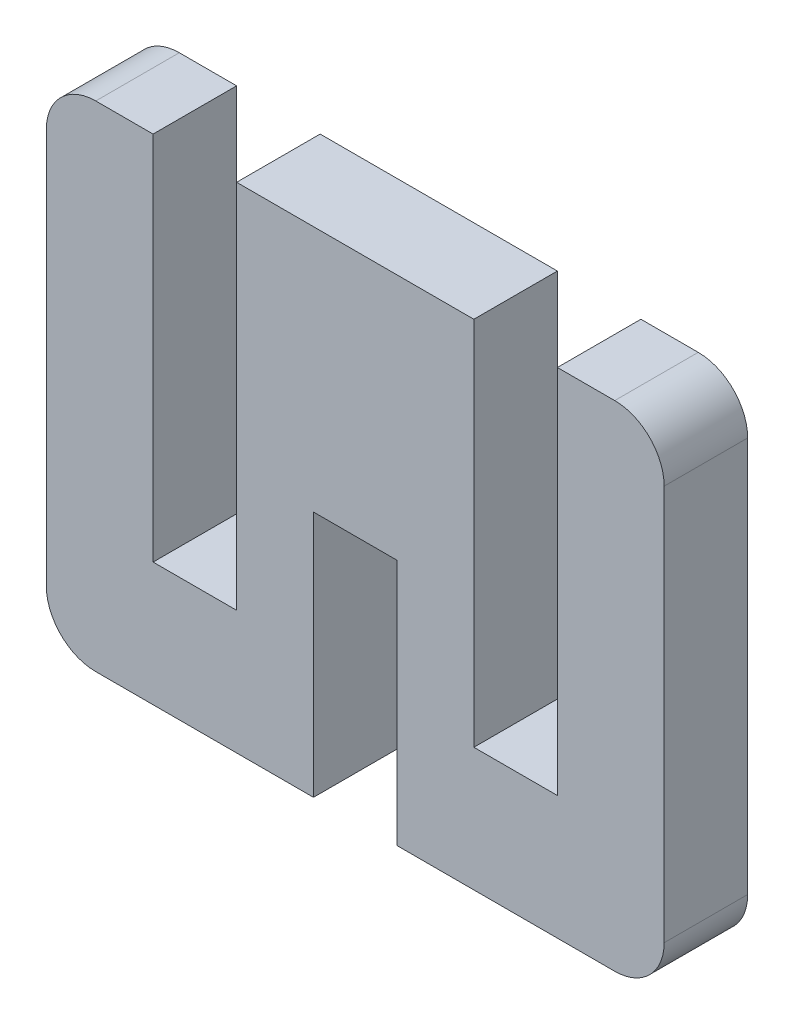
ISO-10303-21;
HEADER;
FILE_DESCRIPTION(('STEP AP214'),'2;1');
FILE_NAME('part.step','',(''),(''),'','','');
FILE_SCHEMA(('AUTOMOTIVE_DESIGN { 1 0 10303 214 1 1 1 1 }'));
ENDSEC;
DATA;
#1=APPLICATION_CONTEXT('core data for automotive mechanical design processes');
#2=APPLICATION_PROTOCOL_DEFINITION('international standard','automotive_design',2000,#1);
#3=PRODUCT_CONTEXT('',#1,'mechanical');
#4=PRODUCT('Part','Part','',(#3));
#5=PRODUCT_RELATED_PRODUCT_CATEGORY('part','',(#4));
#6=PRODUCT_DEFINITION_FORMATION('','',#4);
#7=PRODUCT_DEFINITION_CONTEXT('part definition',#1,'design');
#8=PRODUCT_DEFINITION('design','',#6,#7);
#9=PRODUCT_DEFINITION_SHAPE('','',#8);
#10=(LENGTH_UNIT() NAMED_UNIT(*) SI_UNIT(.MILLI.,.METRE.));
#11=(NAMED_UNIT(*) PLANE_ANGLE_UNIT() SI_UNIT($,.RADIAN.));
#12=(NAMED_UNIT(*) SI_UNIT($,.STERADIAN.) SOLID_ANGLE_UNIT());
#13=UNCERTAINTY_MEASURE_WITH_UNIT(LENGTH_MEASURE(1.E-05),#10,'distance_accuracy_value','');
#14=(GEOMETRIC_REPRESENTATION_CONTEXT(3) GLOBAL_UNCERTAINTY_ASSIGNED_CONTEXT((#13)) GLOBAL_UNIT_ASSIGNED_CONTEXT((#10,
#11,#12)) REPRESENTATION_CONTEXT('',''));
#15=CARTESIAN_POINT('',(0.,0.,0.));
#16=DIRECTION('',(0.,0.,1.));
#17=DIRECTION('',(1.,0.,0.));
#18=AXIS2_PLACEMENT_3D('',#15,#16,#17);
#19=CARTESIAN_POINT('',(-15.875,12.7,4.2926));
#20=DIRECTION('',(0.,-1.,0.));
#21=DIRECTION('',(0.,0.,-1.));
#22=AXIS2_PLACEMENT_3D('',#19,#20,#21);
#23=PLANE('',#22);
#24=DIRECTION('',(0.,0.,1.));
#25=VECTOR('',#24,1.);
#26=CARTESIAN_POINT('',(-6.096,12.7,0.));
#27=LINE('',#26,#25);
#28=CARTESIAN_POINT('',(-6.096,12.7,0.));
#29=VERTEX_POINT('',#28);
#30=CARTESIAN_POINT('',(-6.096,12.7,4.2926));
#31=VERTEX_POINT('',#30);
#32=EDGE_CURVE('E63',#29,#31,#27,.T.);
#33=ORIENTED_EDGE('',*,*,#32,.T.);
#34=DIRECTION('',(-1.,0.,0.));
#35=VECTOR('',#34,1.);
#36=CARTESIAN_POINT('',(-15.875,12.7,4.2926));
#37=LINE('',#36,#35);
#38=CARTESIAN_POINT('',(6.096,12.7,4.2926));
#39=VERTEX_POINT('',#38);
#40=EDGE_CURVE('E302',#39,#31,#37,.T.);
#41=ORIENTED_EDGE('',*,*,#40,.F.);
#42=DIRECTION('',(0.,0.,1.));
#43=VECTOR('',#42,1.);
#44=CARTESIAN_POINT('',(6.096,12.7,0.));
#45=LINE('',#44,#43);
#46=CARTESIAN_POINT('',(6.096,12.7,0.));
#47=VERTEX_POINT('',#46);
#48=EDGE_CURVE('E227',#47,#39,#45,.T.);
#49=ORIENTED_EDGE('',*,*,#48,.F.);
#50=DIRECTION('',(-1.,0.,0.));
#51=VECTOR('',#50,1.);
#52=CARTESIAN_POINT('',(-15.875,12.7,0.));
#53=LINE('',#52,#51);
#54=EDGE_CURVE('E321',#47,#29,#53,.T.);
#55=ORIENTED_EDGE('',*,*,#54,.T.);
#56=EDGE_LOOP('',(#33,#41,#49,#55));
#57=FACE_BOUND('',#56,.T.);
#58=ADVANCED_FACE('F39',(#57),#23,.F.);
#59=DIRECTION('',(0.,0.,1.));
#60=VECTOR('',#59,1.);
#61=CARTESIAN_POINT('',(10.3886,12.7,0.));
#62=LINE('',#61,#60);
#63=CARTESIAN_POINT('',(10.3886,12.7,0.));
#64=VERTEX_POINT('',#63);
#65=CARTESIAN_POINT('',(10.3886,12.7,4.2926));
#66=VERTEX_POINT('',#65);
#67=EDGE_CURVE('E223',#64,#66,#62,.T.);
#68=ORIENTED_EDGE('',*,*,#67,.T.);
#69=CARTESIAN_POINT('',(13.335,12.7,4.2926));
#70=VERTEX_POINT('',#69);
#71=EDGE_CURVE('E297',#70,#66,#37,.T.);
#72=ORIENTED_EDGE('',*,*,#71,.F.);
#73=DIRECTION('',(0.,0.,-1.));
#74=VECTOR('',#73,1.);
#75=CARTESIAN_POINT('',(13.335,12.7,4.2926));
#76=LINE('',#75,#74);
#77=CARTESIAN_POINT('',(13.335,12.7,0.));
#78=VERTEX_POINT('',#77);
#79=EDGE_CURVE('E11',#70,#78,#76,.T.);
#80=ORIENTED_EDGE('',*,*,#79,.T.);
#81=EDGE_CURVE('E316',#78,#64,#53,.T.);
#82=ORIENTED_EDGE('',*,*,#81,.T.);
#83=EDGE_LOOP('',(#68,#72,#80,#82));
#84=FACE_BOUND('',#83,.T.);
#85=ADVANCED_FACE('F440',(#84),#23,.F.);
#86=CARTESIAN_POINT('',(-15.875,-12.7,4.2926));
#87=DIRECTION('',(0.,1.,0.));
#88=DIRECTION('',(0.,0.,1.));
#89=AXIS2_PLACEMENT_3D('',#86,#87,#88);
#90=PLANE('',#89);
#91=DIRECTION('',(0.,0.,1.));
#92=VECTOR('',#91,1.);
#93=CARTESIAN_POINT('',(-2.1463,-12.7,0.));
#94=LINE('',#93,#92);
#95=CARTESIAN_POINT('',(-2.1463,-12.7,0.));
#96=VERTEX_POINT('',#95);
#97=CARTESIAN_POINT('',(-2.1463,-12.7,4.2926));
#98=VERTEX_POINT('',#97);
#99=EDGE_CURVE('E263',#96,#98,#94,.T.);
#100=ORIENTED_EDGE('',*,*,#99,.T.);
#101=DIRECTION('',(1.,0.,0.));
#102=VECTOR('',#101,1.);
#103=CARTESIAN_POINT('',(-15.875,-12.7,4.2926));
#104=LINE('',#103,#102);
#105=CARTESIAN_POINT('',(-13.335,-12.7,4.2926));
#106=VERTEX_POINT('',#105);
#107=EDGE_CURVE('E307',#106,#98,#104,.T.);
#108=ORIENTED_EDGE('',*,*,#107,.F.);
#109=DIRECTION('',(0.,0.,-1.));
#110=VECTOR('',#109,1.);
#111=CARTESIAN_POINT('',(-13.335,-12.7,4.2926));
#112=LINE('',#111,#110);
#113=CARTESIAN_POINT('',(-13.335,-12.7,0.));
#114=VERTEX_POINT('',#113);
#115=EDGE_CURVE('E332',#106,#114,#112,.T.);
#116=ORIENTED_EDGE('',*,*,#115,.T.);
#117=DIRECTION('',(1.,0.,0.));
#118=VECTOR('',#117,1.);
#119=CARTESIAN_POINT('',(-15.875,-12.7,0.));
#120=LINE('',#119,#118);
#121=EDGE_CURVE('E296',#114,#96,#120,.T.);
#122=ORIENTED_EDGE('',*,*,#121,.T.);
#123=EDGE_LOOP('',(#100,#108,#116,#122));
#124=FACE_BOUND('',#123,.T.);
#125=ADVANCED_FACE('F399',(#124),#90,.F.);
#126=CARTESIAN_POINT('',(0.,0.,4.2926));
#127=DIRECTION('',(0.,0.,-1.));
#128=DIRECTION('',(-1.,0.,0.));
#129=AXIS2_PLACEMENT_3D('',#126,#127,#128);
#130=PLANE('',#129);
#131=DIRECTION('',(1.,0.,0.));
#132=VECTOR('',#131,1.);
#133=CARTESIAN_POINT('',(0.,-6.35,4.2926));
#134=LINE('',#133,#132);
#135=CARTESIAN_POINT('',(-10.3886,-6.35,4.2926));
#136=VERTEX_POINT('',#135);
#137=CARTESIAN_POINT('',(-6.096,-6.35,4.2926));
#138=VERTEX_POINT('',#137);
#139=EDGE_CURVE('E193',#136,#138,#134,.T.);
#140=ORIENTED_EDGE('',*,*,#139,.F.);
#141=DIRECTION('',(0.,-1.,0.));
#142=VECTOR('',#141,1.);
#143=CARTESIAN_POINT('',(-10.3886,0.,4.2926));
#144=LINE('',#143,#142);
#145=CARTESIAN_POINT('',(-10.3886,12.7,4.2926));
#146=VERTEX_POINT('',#145);
#147=EDGE_CURVE('E200',#146,#136,#144,.T.);
#148=ORIENTED_EDGE('',*,*,#147,.F.);
#149=CARTESIAN_POINT('',(-13.335,12.7,4.2926));
#150=VERTEX_POINT('',#149);
#151=EDGE_CURVE('E295',#146,#150,#37,.T.);
#152=ORIENTED_EDGE('',*,*,#151,.T.);
#153=CARTESIAN_POINT('',(-13.335,10.16,4.2926));
#154=DIRECTION('',(0.,0.,-1.));
#155=DIRECTION('',(-1.,0.,0.));
#156=AXIS2_PLACEMENT_3D('',#153,#154,#155);
#157=CIRCLE('',#156,2.54);
#158=CARTESIAN_POINT('',(-15.875,10.16,4.2926));
#159=VERTEX_POINT('',#158);
#160=EDGE_CURVE('E357',#150,#159,#157,.F.);
#161=ORIENTED_EDGE('',*,*,#160,.T.);
#162=DIRECTION('',(0.,-1.,0.));
#163=VECTOR('',#162,1.);
#164=CARTESIAN_POINT('',(-15.875,-12.7,4.2926));
#165=LINE('',#164,#163);
#166=CARTESIAN_POINT('',(-15.875,-10.16,4.2926));
#167=VERTEX_POINT('',#166);
#168=EDGE_CURVE('E301',#159,#167,#165,.T.);
#169=ORIENTED_EDGE('',*,*,#168,.T.);
#170=CARTESIAN_POINT('',(-13.335,-10.16,4.2926));
#171=DIRECTION('',(0.,0.,-1.));
#172=DIRECTION('',(-1.,0.,0.));
#173=AXIS2_PLACEMENT_3D('',#170,#171,#172);
#174=CIRCLE('',#173,2.54);
#175=EDGE_CURVE('E366',#167,#106,#174,.F.);
#176=ORIENTED_EDGE('',*,*,#175,.T.);
#177=ORIENTED_EDGE('',*,*,#107,.T.);
#178=DIRECTION('',(0.,1.,0.));
#179=VECTOR('',#178,1.);
#180=CARTESIAN_POINT('',(-2.1463,-12.7,4.2926));
#181=LINE('',#180,#179);
#182=CARTESIAN_POINT('',(-2.1463,0.,4.2926));
#183=VERTEX_POINT('',#182);
#184=EDGE_CURVE('E271',#98,#183,#181,.T.);
#185=ORIENTED_EDGE('',*,*,#184,.T.);
#186=DIRECTION('',(1.,0.,0.));
#187=VECTOR('',#186,1.);
#188=CARTESIAN_POINT('',(-2.1463,0.,4.2926));
#189=LINE('',#188,#187);
#190=CARTESIAN_POINT('',(2.1463,0.,4.2926));
#191=VERTEX_POINT('',#190);
#192=EDGE_CURVE('E236',#183,#191,#189,.T.);
#193=ORIENTED_EDGE('',*,*,#192,.T.);
#194=DIRECTION('',(0.,1.,0.));
#195=VECTOR('',#194,1.);
#196=CARTESIAN_POINT('',(2.1463,-12.7,4.2926));
#197=LINE('',#196,#195);
#198=CARTESIAN_POINT('',(2.1463,-12.7,4.2926));
#199=VERTEX_POINT('',#198);
#200=EDGE_CURVE('E275',#199,#191,#197,.T.);
#201=ORIENTED_EDGE('',*,*,#200,.F.);
#202=CARTESIAN_POINT('',(13.335,-12.7,4.2926));
#203=VERTEX_POINT('',#202);
#204=EDGE_CURVE('E306',#199,#203,#104,.T.);
#205=ORIENTED_EDGE('',*,*,#204,.T.);
#206=CARTESIAN_POINT('',(13.335,-10.16,4.2926));
#207=DIRECTION('',(0.,0.,-1.));
#208=DIRECTION('',(-1.,0.,0.));
#209=AXIS2_PLACEMENT_3D('',#206,#207,#208);
#210=CIRCLE('',#209,2.54);
#211=CARTESIAN_POINT('',(15.875,-10.16,4.2926));
#212=VERTEX_POINT('',#211);
#213=EDGE_CURVE('E363',#203,#212,#210,.F.);
#214=ORIENTED_EDGE('',*,*,#213,.T.);
#215=DIRECTION('',(0.,1.,0.));
#216=VECTOR('',#215,1.);
#217=CARTESIAN_POINT('',(15.875,-12.7,4.2926));
#218=LINE('',#217,#216);
#219=CARTESIAN_POINT('',(15.875,10.16,4.2926));
#220=VERTEX_POINT('',#219);
#221=EDGE_CURVE('E291',#212,#220,#218,.T.);
#222=ORIENTED_EDGE('',*,*,#221,.T.);
#223=CARTESIAN_POINT('',(13.335,10.16,4.2926));
#224=DIRECTION('',(0.,0.,-1.));
#225=DIRECTION('',(-1.,0.,0.));
#226=AXIS2_PLACEMENT_3D('',#223,#224,#225);
#227=CIRCLE('',#226,2.54);
#228=EDGE_CURVE('E360',#220,#70,#227,.F.);
#229=ORIENTED_EDGE('',*,*,#228,.T.);
#230=ORIENTED_EDGE('',*,*,#71,.T.);
#231=DIRECTION('',(0.,-1.,0.));
#232=VECTOR('',#231,1.);
#233=CARTESIAN_POINT('',(10.3886,0.,4.2926));
#234=LINE('',#233,#232);
#235=CARTESIAN_POINT('',(10.3886,-6.35,4.2926));
#236=VERTEX_POINT('',#235);
#237=EDGE_CURVE('E211',#66,#236,#234,.T.);
#238=ORIENTED_EDGE('',*,*,#237,.T.);
#239=DIRECTION('',(1.,0.,0.));
#240=VECTOR('',#239,1.);
#241=CARTESIAN_POINT('',(0.,-6.35,4.2926));
#242=LINE('',#241,#240);
#243=CARTESIAN_POINT('',(6.096,-6.35,4.2926));
#244=VERTEX_POINT('',#243);
#245=EDGE_CURVE('E237',#244,#236,#242,.T.);
#246=ORIENTED_EDGE('',*,*,#245,.F.);
#247=DIRECTION('',(0.,-1.,0.));
#248=VECTOR('',#247,1.);
#249=CARTESIAN_POINT('',(6.096,0.,4.2926));
#250=LINE('',#249,#248);
#251=EDGE_CURVE('E241',#39,#244,#250,.T.);
#252=ORIENTED_EDGE('',*,*,#251,.F.);
#253=ORIENTED_EDGE('',*,*,#40,.T.);
#254=DIRECTION('',(0.,-1.,0.));
#255=VECTOR('',#254,1.);
#256=CARTESIAN_POINT('',(-6.096,0.,4.2926));
#257=LINE('',#256,#255);
#258=EDGE_CURVE('E204',#31,#138,#257,.T.);
#259=ORIENTED_EDGE('',*,*,#258,.T.);
#260=EDGE_LOOP('',(#140,#148,#152,#161,#169,#176,#177,#185,#193,#201,#205,#214,#222,#229,#230,
#238,#246,#252,#253,#259));
#261=FACE_BOUND('',#260,.T.);
#262=ADVANCED_FACE('F387',(#261),#130,.F.);
#263=CARTESIAN_POINT('',(0.,0.,0.));
#264=DIRECTION('',(0.,0.,-1.));
#265=DIRECTION('',(-1.,0.,0.));
#266=AXIS2_PLACEMENT_3D('',#263,#264,#265);
#267=PLANE('',#266);
#268=DIRECTION('',(0.,-1.,0.));
#269=VECTOR('',#268,1.);
#270=CARTESIAN_POINT('',(-10.3886,0.,0.));
#271=LINE('',#270,#269);
#272=CARTESIAN_POINT('',(-10.3886,12.7,0.));
#273=VERTEX_POINT('',#272);
#274=CARTESIAN_POINT('',(-10.3886,-6.35,0.));
#275=VERTEX_POINT('',#274);
#276=EDGE_CURVE('E185',#273,#275,#271,.T.);
#277=ORIENTED_EDGE('',*,*,#276,.T.);
#278=DIRECTION('',(1.,0.,0.));
#279=VECTOR('',#278,1.);
#280=CARTESIAN_POINT('',(0.,-6.35,0.));
#281=LINE('',#280,#279);
#282=CARTESIAN_POINT('',(-6.096,-6.35,0.));
#283=VERTEX_POINT('',#282);
#284=EDGE_CURVE('E186',#275,#283,#281,.T.);
#285=ORIENTED_EDGE('',*,*,#284,.T.);
#286=DIRECTION('',(0.,-1.,0.));
#287=VECTOR('',#286,1.);
#288=CARTESIAN_POINT('',(-6.096,0.,0.));
#289=LINE('',#288,#287);
#290=EDGE_CURVE('E175',#29,#283,#289,.T.);
#291=ORIENTED_EDGE('',*,*,#290,.F.);
#292=ORIENTED_EDGE('',*,*,#54,.F.);
#293=DIRECTION('',(0.,-1.,0.));
#294=VECTOR('',#293,1.);
#295=CARTESIAN_POINT('',(6.096,0.,0.));
#296=LINE('',#295,#294);
#297=CARTESIAN_POINT('',(6.096,-6.35,0.));
#298=VERTEX_POINT('',#297);
#299=EDGE_CURVE('E251',#47,#298,#296,.T.);
#300=ORIENTED_EDGE('',*,*,#299,.T.);
#301=DIRECTION('',(1.,0.,0.));
#302=VECTOR('',#301,1.);
#303=CARTESIAN_POINT('',(0.,-6.35,0.));
#304=LINE('',#303,#302);
#305=CARTESIAN_POINT('',(10.3886,-6.35,0.));
#306=VERTEX_POINT('',#305);
#307=EDGE_CURVE('E55',#298,#306,#304,.T.);
#308=ORIENTED_EDGE('',*,*,#307,.T.);
#309=DIRECTION('',(0.,-1.,0.));
#310=VECTOR('',#309,1.);
#311=CARTESIAN_POINT('',(10.3886,0.,0.));
#312=LINE('',#311,#310);
#313=EDGE_CURVE('E242',#64,#306,#312,.T.);
#314=ORIENTED_EDGE('',*,*,#313,.F.);
#315=ORIENTED_EDGE('',*,*,#81,.F.);
#316=CARTESIAN_POINT('',(13.335,10.16,0.));
#317=DIRECTION('',(0.,0.,-1.));
#318=DIRECTION('',(-1.,0.,0.));
#319=AXIS2_PLACEMENT_3D('',#316,#317,#318);
#320=CIRCLE('',#319,2.54);
#321=CARTESIAN_POINT('',(15.875,10.16,0.));
#322=VERTEX_POINT('',#321);
#323=EDGE_CURVE('E340',#78,#322,#320,.T.);
#324=ORIENTED_EDGE('',*,*,#323,.T.);
#325=DIRECTION('',(0.,1.,0.));
#326=VECTOR('',#325,1.);
#327=CARTESIAN_POINT('',(15.875,-12.7,0.));
#328=LINE('',#327,#326);
#329=CARTESIAN_POINT('',(15.875,-10.16,0.));
#330=VERTEX_POINT('',#329);
#331=EDGE_CURVE('E217',#330,#322,#328,.T.);
#332=ORIENTED_EDGE('',*,*,#331,.F.);
#333=CARTESIAN_POINT('',(13.335,-10.16,0.));
#334=DIRECTION('',(0.,0.,-1.));
#335=DIRECTION('',(-1.,0.,0.));
#336=AXIS2_PLACEMENT_3D('',#333,#334,#335);
#337=CIRCLE('',#336,2.54);
#338=CARTESIAN_POINT('',(13.335,-12.7,0.));
#339=VERTEX_POINT('',#338);
#340=EDGE_CURVE('E343',#330,#339,#337,.T.);
#341=ORIENTED_EDGE('',*,*,#340,.T.);
#342=CARTESIAN_POINT('',(2.1463,-12.7,0.));
#343=VERTEX_POINT('',#342);
#344=EDGE_CURVE('E325',#343,#339,#120,.T.);
#345=ORIENTED_EDGE('',*,*,#344,.F.);
#346=DIRECTION('',(0.,1.,0.));
#347=VECTOR('',#346,1.);
#348=CARTESIAN_POINT('',(2.1463,-12.7,0.));
#349=LINE('',#348,#347);
#350=CARTESIAN_POINT('',(2.1463,0.,0.));
#351=VERTEX_POINT('',#350);
#352=EDGE_CURVE('E285',#343,#351,#349,.T.);
#353=ORIENTED_EDGE('',*,*,#352,.T.);
#354=DIRECTION('',(1.,0.,0.));
#355=VECTOR('',#354,1.);
#356=CARTESIAN_POINT('',(-2.1463,0.,0.));
#357=LINE('',#356,#355);
#358=CARTESIAN_POINT('',(-2.1463,0.,0.));
#359=VERTEX_POINT('',#358);
#360=EDGE_CURVE('E276',#359,#351,#357,.T.);
#361=ORIENTED_EDGE('',*,*,#360,.F.);
#362=DIRECTION('',(0.,1.,0.));
#363=VECTOR('',#362,1.);
#364=CARTESIAN_POINT('',(-2.1463,-12.7,0.));
#365=LINE('',#364,#363);
#366=EDGE_CURVE('E270',#96,#359,#365,.T.);
#367=ORIENTED_EDGE('',*,*,#366,.F.);
#368=ORIENTED_EDGE('',*,*,#121,.F.);
#369=CARTESIAN_POINT('',(-13.335,-10.16,0.));
#370=DIRECTION('',(0.,0.,-1.));
#371=DIRECTION('',(-1.,0.,0.));
#372=AXIS2_PLACEMENT_3D('',#369,#370,#371);
#373=CIRCLE('',#372,2.54);
#374=CARTESIAN_POINT('',(-15.875,-10.16,0.));
#375=VERTEX_POINT('',#374);
#376=EDGE_CURVE('E347',#114,#375,#373,.T.);
#377=ORIENTED_EDGE('',*,*,#376,.T.);
#378=DIRECTION('',(0.,-1.,0.));
#379=VECTOR('',#378,1.);
#380=CARTESIAN_POINT('',(-15.875,-12.7,0.));
#381=LINE('',#380,#379);
#382=CARTESIAN_POINT('',(-15.875,10.16,0.));
#383=VERTEX_POINT('',#382);
#384=EDGE_CURVE('E320',#383,#375,#381,.T.);
#385=ORIENTED_EDGE('',*,*,#384,.F.);
#386=CARTESIAN_POINT('',(-13.335,10.16,0.));
#387=DIRECTION('',(0.,0.,-1.));
#388=DIRECTION('',(-1.,0.,0.));
#389=AXIS2_PLACEMENT_3D('',#386,#387,#388);
#390=CIRCLE('',#389,2.54);
#391=CARTESIAN_POINT('',(-13.335,12.7,0.));
#392=VERTEX_POINT('',#391);
#393=EDGE_CURVE('E336',#383,#392,#390,.T.);
#394=ORIENTED_EDGE('',*,*,#393,.T.);
#395=EDGE_CURVE('E315',#273,#392,#53,.T.);
#396=ORIENTED_EDGE('',*,*,#395,.F.);
#397=EDGE_LOOP('',(#277,#285,#291,#292,#300,#308,#314,#315,#324,#332,#341,#345,#353,#361,#367,
#368,#377,#385,#394,#396));
#398=FACE_BOUND('',#397,.T.);
#399=ADVANCED_FACE('F197',(#398),#267,.T.);
#400=CARTESIAN_POINT('',(15.875,-12.7,4.2926));
#401=DIRECTION('',(-1.,0.,0.));
#402=DIRECTION('',(0.,0.,1.));
#403=AXIS2_PLACEMENT_3D('',#400,#401,#402);
#404=PLANE('',#403);
#405=ORIENTED_EDGE('',*,*,#221,.F.);
#406=DIRECTION('',(0.,0.,-1.));
#407=VECTOR('',#406,1.);
#408=CARTESIAN_POINT('',(15.875,-10.16,4.2926));
#409=LINE('',#408,#407);
#410=EDGE_CURVE('E372',#212,#330,#409,.T.);
#411=ORIENTED_EDGE('',*,*,#410,.T.);
#412=ORIENTED_EDGE('',*,*,#331,.T.);
#413=DIRECTION('',(0.,0.,-1.));
#414=VECTOR('',#413,1.);
#415=CARTESIAN_POINT('',(15.875,10.16,4.2926));
#416=LINE('',#415,#414);
#417=EDGE_CURVE('E369',#322,#220,#416,.F.);
#418=ORIENTED_EDGE('',*,*,#417,.T.);
#419=EDGE_LOOP('',(#405,#411,#412,#418));
#420=FACE_BOUND('',#419,.T.);
#421=ADVANCED_FACE('F448',(#420),#404,.F.);
#422=ORIENTED_EDGE('',*,*,#151,.F.);
#423=DIRECTION('',(0.,0.,1.));
#424=VECTOR('',#423,1.);
#425=CARTESIAN_POINT('',(-10.3886,12.7,0.));
#426=LINE('',#425,#424);
#427=EDGE_CURVE('E218',#273,#146,#426,.T.);
#428=ORIENTED_EDGE('',*,*,#427,.F.);
#429=ORIENTED_EDGE('',*,*,#395,.T.);
#430=DIRECTION('',(0.,0.,-1.));
#431=VECTOR('',#430,1.);
#432=CARTESIAN_POINT('',(-13.335,12.7,4.2926));
#433=LINE('',#432,#431);
#434=EDGE_CURVE('E48',#392,#150,#433,.F.);
#435=ORIENTED_EDGE('',*,*,#434,.T.);
#436=EDGE_LOOP('',(#422,#428,#429,#435));
#437=FACE_BOUND('',#436,.T.);
#438=ADVANCED_FACE('F381',(#437),#23,.F.);
#439=CARTESIAN_POINT('',(-15.875,-12.7,4.2926));
#440=DIRECTION('',(1.,0.,0.));
#441=DIRECTION('',(0.,0.,-1.));
#442=AXIS2_PLACEMENT_3D('',#439,#440,#441);
#443=PLANE('',#442);
#444=ORIENTED_EDGE('',*,*,#384,.T.);
#445=DIRECTION('',(0.,0.,-1.));
#446=VECTOR('',#445,1.);
#447=CARTESIAN_POINT('',(-15.875,-10.16,4.2926));
#448=LINE('',#447,#446);
#449=EDGE_CURVE('E354',#375,#167,#448,.F.);
#450=ORIENTED_EDGE('',*,*,#449,.T.);
#451=ORIENTED_EDGE('',*,*,#168,.F.);
#452=DIRECTION('',(0.,0.,-1.));
#453=VECTOR('',#452,1.);
#454=CARTESIAN_POINT('',(-15.875,10.16,4.2926));
#455=LINE('',#454,#453);
#456=EDGE_CURVE('E350',#159,#383,#455,.T.);
#457=ORIENTED_EDGE('',*,*,#456,.T.);
#458=EDGE_LOOP('',(#444,#450,#451,#457));
#459=FACE_BOUND('',#458,.T.);
#460=ADVANCED_FACE('F391',(#459),#443,.F.);
#461=ORIENTED_EDGE('',*,*,#204,.F.);
#462=DIRECTION('',(0.,0.,1.));
#463=VECTOR('',#462,1.);
#464=CARTESIAN_POINT('',(2.1463,-12.7,0.));
#465=LINE('',#464,#463);
#466=EDGE_CURVE('E260',#343,#199,#465,.T.);
#467=ORIENTED_EDGE('',*,*,#466,.F.);
#468=ORIENTED_EDGE('',*,*,#344,.T.);
#469=DIRECTION('',(0.,0.,-1.));
#470=VECTOR('',#469,1.);
#471=CARTESIAN_POINT('',(13.335,-12.7,4.2926));
#472=LINE('',#471,#470);
#473=EDGE_CURVE('E311',#339,#203,#472,.F.);
#474=ORIENTED_EDGE('',*,*,#473,.T.);
#475=EDGE_LOOP('',(#461,#467,#468,#474));
#476=FACE_BOUND('',#475,.T.);
#477=ADVANCED_FACE('F417',(#476),#90,.F.);
#478=CARTESIAN_POINT('',(-13.335,-10.16,4.2926));
#479=DIRECTION('',(0.,0.,-1.));
#480=DIRECTION('',(-1.,0.,0.));
#481=AXIS2_PLACEMENT_3D('',#478,#479,#480);
#482=CYLINDRICAL_SURFACE('',#481,2.54);
#483=ORIENTED_EDGE('',*,*,#175,.F.);
#484=ORIENTED_EDGE('',*,*,#449,.F.);
#485=ORIENTED_EDGE('',*,*,#376,.F.);
#486=ORIENTED_EDGE('',*,*,#115,.F.);
#487=EDGE_LOOP('',(#483,#484,#485,#486));
#488=FACE_BOUND('',#487,.T.);
#489=ADVANCED_FACE('F395',(#488),#482,.T.);
#490=CARTESIAN_POINT('',(13.335,-10.16,4.2926));
#491=DIRECTION('',(0.,0.,-1.));
#492=DIRECTION('',(-1.,0.,0.));
#493=AXIS2_PLACEMENT_3D('',#490,#491,#492);
#494=CYLINDRICAL_SURFACE('',#493,2.54);
#495=ORIENTED_EDGE('',*,*,#213,.F.);
#496=ORIENTED_EDGE('',*,*,#473,.F.);
#497=ORIENTED_EDGE('',*,*,#340,.F.);
#498=ORIENTED_EDGE('',*,*,#410,.F.);
#499=EDGE_LOOP('',(#495,#496,#497,#498));
#500=FACE_BOUND('',#499,.T.);
#501=ADVANCED_FACE('F453',(#500),#494,.T.);
#502=CARTESIAN_POINT('',(13.335,10.16,4.2926));
#503=DIRECTION('',(0.,0.,-1.));
#504=DIRECTION('',(-1.,0.,0.));
#505=AXIS2_PLACEMENT_3D('',#502,#503,#504);
#506=CYLINDRICAL_SURFACE('',#505,2.54);
#507=ORIENTED_EDGE('',*,*,#228,.F.);
#508=ORIENTED_EDGE('',*,*,#417,.F.);
#509=ORIENTED_EDGE('',*,*,#323,.F.);
#510=ORIENTED_EDGE('',*,*,#79,.F.);
#511=EDGE_LOOP('',(#507,#508,#509,#510));
#512=FACE_BOUND('',#511,.T.);
#513=ADVANCED_FACE('F451',(#512),#506,.T.);
#514=CARTESIAN_POINT('',(-13.335,10.16,4.2926));
#515=DIRECTION('',(0.,0.,-1.));
#516=DIRECTION('',(-1.,0.,0.));
#517=AXIS2_PLACEMENT_3D('',#514,#515,#516);
#518=CYLINDRICAL_SURFACE('',#517,2.54);
#519=ORIENTED_EDGE('',*,*,#160,.F.);
#520=ORIENTED_EDGE('',*,*,#434,.F.);
#521=ORIENTED_EDGE('',*,*,#393,.F.);
#522=ORIENTED_EDGE('',*,*,#456,.F.);
#523=EDGE_LOOP('',(#519,#520,#521,#522));
#524=FACE_BOUND('',#523,.T.);
#525=ADVANCED_FACE('F41',(#524),#518,.T.);
#526=CARTESIAN_POINT('',(-2.1463,0.,0.));
#527=DIRECTION('',(0.,-1.,0.));
#528=DIRECTION('',(0.,0.,-1.));
#529=AXIS2_PLACEMENT_3D('',#526,#527,#528);
#530=PLANE('',#529);
#531=ORIENTED_EDGE('',*,*,#192,.F.);
#532=DIRECTION('',(0.,0.,1.));
#533=VECTOR('',#532,1.);
#534=CARTESIAN_POINT('',(-2.1463,0.,0.));
#535=LINE('',#534,#533);
#536=EDGE_CURVE('E267',#359,#183,#535,.T.);
#537=ORIENTED_EDGE('',*,*,#536,.F.);
#538=ORIENTED_EDGE('',*,*,#360,.T.);
#539=DIRECTION('',(0.,0.,1.));
#540=VECTOR('',#539,1.);
#541=CARTESIAN_POINT('',(2.1463,0.,0.));
#542=LINE('',#541,#540);
#543=EDGE_CURVE('E257',#351,#191,#542,.T.);
#544=ORIENTED_EDGE('',*,*,#543,.T.);
#545=EDGE_LOOP('',(#531,#537,#538,#544));
#546=FACE_BOUND('',#545,.T.);
#547=ADVANCED_FACE('F410',(#546),#530,.T.);
#548=CARTESIAN_POINT('',(2.1463,-12.7,0.));
#549=DIRECTION('',(1.,0.,0.));
#550=DIRECTION('',(0.,0.,-1.));
#551=AXIS2_PLACEMENT_3D('',#548,#549,#550);
#552=PLANE('',#551);
#553=ORIENTED_EDGE('',*,*,#200,.T.);
#554=ORIENTED_EDGE('',*,*,#543,.F.);
#555=ORIENTED_EDGE('',*,*,#352,.F.);
#556=ORIENTED_EDGE('',*,*,#466,.T.);
#557=EDGE_LOOP('',(#553,#554,#555,#556));
#558=FACE_BOUND('',#557,.T.);
#559=ADVANCED_FACE('F412',(#558),#552,.F.);
#560=CARTESIAN_POINT('',(-2.1463,-12.7,0.));
#561=DIRECTION('',(1.,0.,0.));
#562=DIRECTION('',(0.,0.,-1.));
#563=AXIS2_PLACEMENT_3D('',#560,#561,#562);
#564=PLANE('',#563);
#565=ORIENTED_EDGE('',*,*,#184,.F.);
#566=ORIENTED_EDGE('',*,*,#99,.F.);
#567=ORIENTED_EDGE('',*,*,#366,.T.);
#568=ORIENTED_EDGE('',*,*,#536,.T.);
#569=EDGE_LOOP('',(#565,#566,#567,#568));
#570=FACE_BOUND('',#569,.T.);
#571=ADVANCED_FACE('F403',(#570),#564,.T.);
#572=CARTESIAN_POINT('',(10.3886,0.,0.));
#573=DIRECTION('',(-1.,0.,0.));
#574=DIRECTION('',(0.,0.,1.));
#575=AXIS2_PLACEMENT_3D('',#572,#573,#574);
#576=PLANE('',#575);
#577=ORIENTED_EDGE('',*,*,#237,.F.);
#578=ORIENTED_EDGE('',*,*,#67,.F.);
#579=ORIENTED_EDGE('',*,*,#313,.T.);
#580=DIRECTION('',(0.,0.,1.));
#581=VECTOR('',#580,1.);
#582=CARTESIAN_POINT('',(10.3886,-6.35,0.));
#583=LINE('',#582,#581);
#584=EDGE_CURVE('E233',#306,#236,#583,.T.);
#585=ORIENTED_EDGE('',*,*,#584,.T.);
#586=EDGE_LOOP('',(#577,#578,#579,#585));
#587=FACE_BOUND('',#586,.T.);
#588=ADVANCED_FACE('F438',(#587),#576,.T.);
#589=CARTESIAN_POINT('',(0.,-6.35,0.));
#590=DIRECTION('',(0.,-1.,0.));
#591=DIRECTION('',(0.,0.,-1.));
#592=AXIS2_PLACEMENT_3D('',#589,#590,#591);
#593=PLANE('',#592);
#594=ORIENTED_EDGE('',*,*,#245,.T.);
#595=ORIENTED_EDGE('',*,*,#584,.F.);
#596=ORIENTED_EDGE('',*,*,#307,.F.);
#597=DIRECTION('',(0.,0.,1.));
#598=VECTOR('',#597,1.);
#599=CARTESIAN_POINT('',(6.096,-6.35,0.));
#600=LINE('',#599,#598);
#601=EDGE_CURVE('E230',#298,#244,#600,.T.);
#602=ORIENTED_EDGE('',*,*,#601,.T.);
#603=EDGE_LOOP('',(#594,#595,#596,#602));
#604=FACE_BOUND('',#603,.T.);
#605=ADVANCED_FACE('F435',(#604),#593,.F.);
#606=CARTESIAN_POINT('',(6.096,0.,0.));
#607=DIRECTION('',(-1.,0.,0.));
#608=DIRECTION('',(0.,0.,1.));
#609=AXIS2_PLACEMENT_3D('',#606,#607,#608);
#610=PLANE('',#609);
#611=ORIENTED_EDGE('',*,*,#251,.T.);
#612=ORIENTED_EDGE('',*,*,#601,.F.);
#613=ORIENTED_EDGE('',*,*,#299,.F.);
#614=ORIENTED_EDGE('',*,*,#48,.T.);
#615=EDGE_LOOP('',(#611,#612,#613,#614));
#616=FACE_BOUND('',#615,.T.);
#617=ADVANCED_FACE('F432',(#616),#610,.F.);
#618=CARTESIAN_POINT('',(0.,-6.35,0.));
#619=DIRECTION('',(0.,-1.,0.));
#620=DIRECTION('',(0.,0.,-1.));
#621=AXIS2_PLACEMENT_3D('',#618,#619,#620);
#622=PLANE('',#621);
#623=ORIENTED_EDGE('',*,*,#139,.T.);
#624=DIRECTION('',(0.,0.,1.));
#625=VECTOR('',#624,1.);
#626=CARTESIAN_POINT('',(-6.096,-6.35,0.));
#627=LINE('',#626,#625);
#628=EDGE_CURVE('E178',#283,#138,#627,.T.);
#629=ORIENTED_EDGE('',*,*,#628,.F.);
#630=ORIENTED_EDGE('',*,*,#284,.F.);
#631=DIRECTION('',(0.,0.,1.));
#632=VECTOR('',#631,1.);
#633=CARTESIAN_POINT('',(-10.3886,-6.35,0.));
#634=LINE('',#633,#632);
#635=EDGE_CURVE('E214',#275,#136,#634,.T.);
#636=ORIENTED_EDGE('',*,*,#635,.T.);
#637=EDGE_LOOP('',(#623,#629,#630,#636));
#638=FACE_BOUND('',#637,.T.);
#639=ADVANCED_FACE('F190',(#638),#622,.F.);
#640=CARTESIAN_POINT('',(-10.3886,0.,0.));
#641=DIRECTION('',(-1.,0.,0.));
#642=DIRECTION('',(0.,0.,1.));
#643=AXIS2_PLACEMENT_3D('',#640,#641,#642);
#644=PLANE('',#643);
#645=ORIENTED_EDGE('',*,*,#147,.T.);
#646=ORIENTED_EDGE('',*,*,#635,.F.);
#647=ORIENTED_EDGE('',*,*,#276,.F.);
#648=ORIENTED_EDGE('',*,*,#427,.T.);
#649=EDGE_LOOP('',(#645,#646,#647,#648));
#650=FACE_BOUND('',#649,.T.);
#651=ADVANCED_FACE('F569',(#650),#644,.F.);
#652=CARTESIAN_POINT('',(-6.096,0.,0.));
#653=DIRECTION('',(-1.,0.,0.));
#654=DIRECTION('',(0.,0.,1.));
#655=AXIS2_PLACEMENT_3D('',#652,#653,#654);
#656=PLANE('',#655);
#657=ORIENTED_EDGE('',*,*,#258,.F.);
#658=ORIENTED_EDGE('',*,*,#32,.F.);
#659=ORIENTED_EDGE('',*,*,#290,.T.);
#660=ORIENTED_EDGE('',*,*,#628,.T.);
#661=EDGE_LOOP('',(#657,#658,#659,#660));
#662=FACE_BOUND('',#661,.T.);
#663=ADVANCED_FACE('F177',(#662),#656,.T.);
#664=CLOSED_SHELL('',(#58,#85,#125,#262,#399,#421,#438,#460,#477,#489,#501,#513,#525,#547,#559,
#571,#588,#605,#617,#639,#651,#663));
#665=MANIFOLD_SOLID_BREP('B2',#664);
#666=ADVANCED_BREP_SHAPE_REPRESENTATION('',(#18,#665),#14);
#667=SHAPE_DEFINITION_REPRESENTATION(#9,#666);
ENDSEC;
END-ISO-10303-21;
